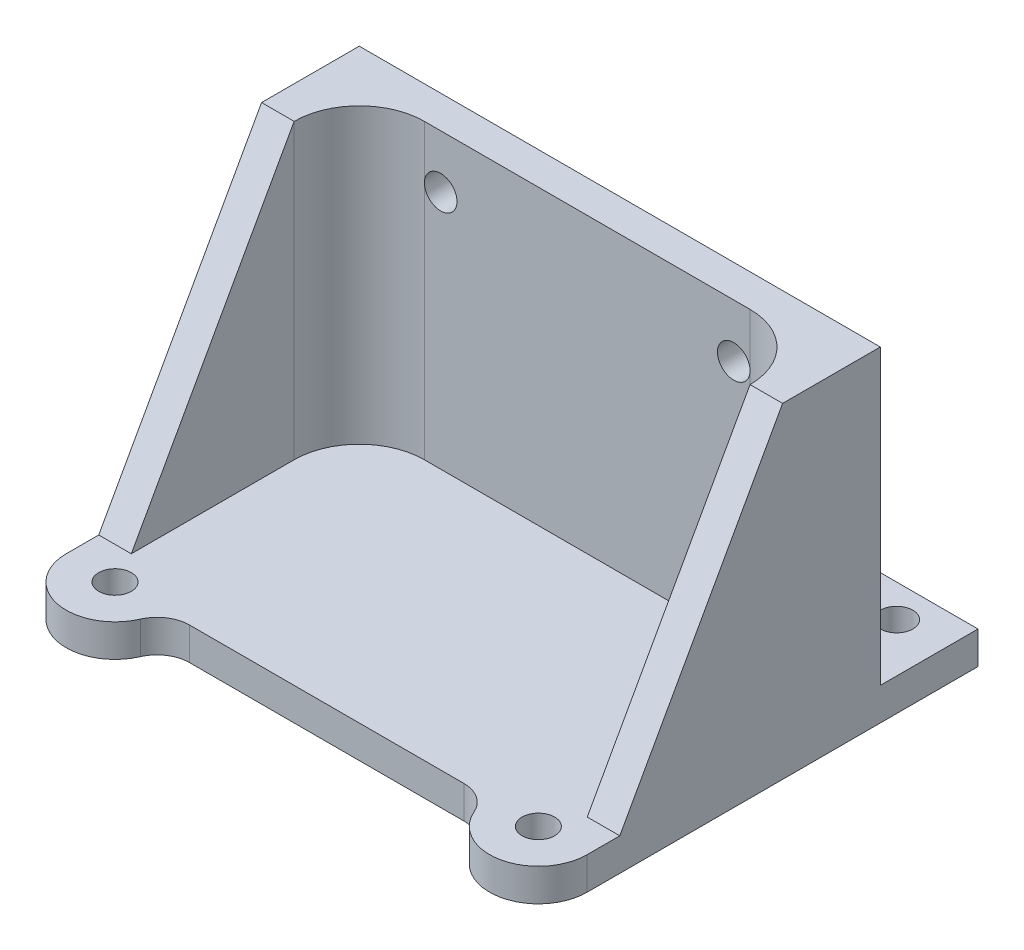
ISO-10303-21;
HEADER;
FILE_DESCRIPTION(('STEP AP214'),'2;1');
FILE_NAME('part.step','',(''),(''),'','','');
FILE_SCHEMA(('AUTOMOTIVE_DESIGN { 1 0 10303 214 1 1 1 1 }'));
ENDSEC;
DATA;
#1=APPLICATION_CONTEXT('core data for automotive mechanical design processes');
#2=APPLICATION_PROTOCOL_DEFINITION('international standard','automotive_design',2000,#1);
#3=PRODUCT_CONTEXT('',#1,'mechanical');
#4=PRODUCT('Part','Part','',(#3));
#5=PRODUCT_RELATED_PRODUCT_CATEGORY('part','',(#4));
#6=PRODUCT_DEFINITION_FORMATION('','',#4);
#7=PRODUCT_DEFINITION_CONTEXT('part definition',#1,'design');
#8=PRODUCT_DEFINITION('design','',#6,#7);
#9=PRODUCT_DEFINITION_SHAPE('','',#8);
#10=(LENGTH_UNIT() NAMED_UNIT(*) SI_UNIT(.MILLI.,.METRE.));
#11=(NAMED_UNIT(*) PLANE_ANGLE_UNIT() SI_UNIT($,.RADIAN.));
#12=(NAMED_UNIT(*) SI_UNIT($,.STERADIAN.) SOLID_ANGLE_UNIT());
#13=UNCERTAINTY_MEASURE_WITH_UNIT(LENGTH_MEASURE(1.E-05),#10,'distance_accuracy_value','');
#14=(GEOMETRIC_REPRESENTATION_CONTEXT(3) GLOBAL_UNCERTAINTY_ASSIGNED_CONTEXT((#13)) GLOBAL_UNIT_ASSIGNED_CONTEXT((#10,
#11,#12)) REPRESENTATION_CONTEXT('',''));
#15=CARTESIAN_POINT('',(0.,0.,0.));
#16=DIRECTION('',(0.,0.,1.));
#17=DIRECTION('',(1.,0.,0.));
#18=AXIS2_PLACEMENT_3D('',#15,#16,#17);
#19=CARTESIAN_POINT('',(0.,5.,30.));
#20=DIRECTION('',(0.,0.,-1.));
#21=DIRECTION('',(-1.,0.,0.));
#22=AXIS2_PLACEMENT_3D('',#19,#20,#21);
#23=PLANE('',#22);
#24=DIRECTION('',(1.,0.,0.));
#25=VECTOR('',#24,1.);
#26=CARTESIAN_POINT('',(0.,0.,30.));
#27=LINE('',#26,#25);
#28=CARTESIAN_POINT('',(-21.0435607626104,0.,30.));
#29=VERTEX_POINT('',#28);
#30=CARTESIAN_POINT('',(21.0435607626104,0.,30.));
#31=VERTEX_POINT('',#30);
#32=EDGE_CURVE('E197',#29,#31,#27,.T.);
#33=ORIENTED_EDGE('',*,*,#32,.T.);
#34=DIRECTION('',(0.,1.,0.));
#35=VECTOR('',#34,1.);
#36=CARTESIAN_POINT('',(21.0435607626104,5.,30.));
#37=LINE('',#36,#35);
#38=CARTESIAN_POINT('',(21.0435607626104,5.,30.));
#39=VERTEX_POINT('',#38);
#40=EDGE_CURVE('E289',#31,#39,#37,.T.);
#41=ORIENTED_EDGE('',*,*,#40,.T.);
#42=DIRECTION('',(1.,0.,0.));
#43=VECTOR('',#42,1.);
#44=CARTESIAN_POINT('',(0.,5.,30.));
#45=LINE('',#44,#43);
#46=CARTESIAN_POINT('',(-21.0435607626104,5.,30.));
#47=VERTEX_POINT('',#46);
#48=EDGE_CURVE('E231',#47,#39,#45,.T.);
#49=ORIENTED_EDGE('',*,*,#48,.F.);
#50=DIRECTION('',(0.,1.,0.));
#51=VECTOR('',#50,1.);
#52=CARTESIAN_POINT('',(-21.0435607626104,0.,30.));
#53=LINE('',#52,#51);
#54=EDGE_CURVE('E286',#47,#29,#53,.F.);
#55=ORIENTED_EDGE('',*,*,#54,.T.);
#56=EDGE_LOOP('',(#33,#41,#49,#55));
#57=FACE_BOUND('',#56,.T.);
#58=ADVANCED_FACE('F35',(#57),#23,.F.);
#59=CARTESIAN_POINT('',(32.5,5.,30.));
#60=DIRECTION('',(0.,-1.,0.));
#61=DIRECTION('',(0.,0.,-1.));
#62=AXIS2_PLACEMENT_3D('',#59,#60,#61);
#63=CYLINDRICAL_SURFACE('',#62,7.5);
#64=CARTESIAN_POINT('',(32.5,5.,30.));
#65=DIRECTION('',(0.,1.,0.));
#66=DIRECTION('',(0.,0.,1.));
#67=AXIS2_PLACEMENT_3D('',#64,#65,#66);
#68=CIRCLE('',#67,7.5);
#69=CARTESIAN_POINT('',(25.6261364575662,5.,33.));
#70=VERTEX_POINT('',#69);
#71=CARTESIAN_POINT('',(40.,5.,30.));
#72=VERTEX_POINT('',#71);
#73=EDGE_CURVE('E234',#70,#72,#68,.T.);
#74=ORIENTED_EDGE('',*,*,#73,.F.);
#75=DIRECTION('',(0.,-1.,0.));
#76=VECTOR('',#75,1.);
#77=CARTESIAN_POINT('',(25.6261364575662,5.,33.));
#78=LINE('',#77,#76);
#79=CARTESIAN_POINT('',(25.6261364575662,0.,33.));
#80=VERTEX_POINT('',#79);
#81=EDGE_CURVE('E283',#70,#80,#78,.T.);
#82=ORIENTED_EDGE('',*,*,#81,.T.);
#83=CARTESIAN_POINT('',(32.5,0.,30.));
#84=DIRECTION('',(0.,1.,0.));
#85=DIRECTION('',(0.,0.,1.));
#86=AXIS2_PLACEMENT_3D('',#83,#84,#85);
#87=CIRCLE('',#86,7.5);
#88=CARTESIAN_POINT('',(40.,0.,30.));
#89=VERTEX_POINT('',#88);
#90=EDGE_CURVE('E200',#80,#89,#87,.T.);
#91=ORIENTED_EDGE('',*,*,#90,.T.);
#92=DIRECTION('',(0.,-1.,0.));
#93=VECTOR('',#92,1.);
#94=CARTESIAN_POINT('',(40.,5.,30.));
#95=LINE('',#94,#93);
#96=EDGE_CURVE('E210',#72,#89,#95,.T.);
#97=ORIENTED_EDGE('',*,*,#96,.F.);
#98=EDGE_LOOP('',(#74,#82,#91,#97));
#99=FACE_BOUND('',#98,.T.);
#100=ADVANCED_FACE('F303',(#99),#63,.T.);
#101=CARTESIAN_POINT('',(40.,5.,0.));
#102=DIRECTION('',(-1.,0.,0.));
#103=DIRECTION('',(0.,0.,1.));
#104=AXIS2_PLACEMENT_3D('',#101,#102,#103);
#105=PLANE('',#104);
#106=DIRECTION('',(0.,0.,-1.));
#107=VECTOR('',#106,1.);
#108=CARTESIAN_POINT('',(40.,50.,0.));
#109=LINE('',#108,#107);
#110=CARTESIAN_POINT('',(40.,50.,0.));
#111=VERTEX_POINT('',#110);
#112=CARTESIAN_POINT('',(40.,50.,-15.));
#113=VERTEX_POINT('',#112);
#114=EDGE_CURVE('E344',#111,#113,#109,.T.);
#115=ORIENTED_EDGE('',*,*,#114,.F.);
#116=DIRECTION('',(0.,0.874157276121538,-0.485642931178632));
#117=VECTOR('',#116,1.);
#118=CARTESIAN_POINT('',(40.,50.,0.));
#119=LINE('',#118,#117);
#120=CARTESIAN_POINT('',(40.,5.,25.));
#121=VERTEX_POINT('',#120);
#122=EDGE_CURVE('E171',#121,#111,#119,.T.);
#123=ORIENTED_EDGE('',*,*,#122,.F.);
#124=DIRECTION('',(0.,0.,-1.));
#125=VECTOR('',#124,1.);
#126=CARTESIAN_POINT('',(40.,5.,0.));
#127=LINE('',#126,#125);
#128=EDGE_CURVE('E236',#72,#121,#127,.T.);
#129=ORIENTED_EDGE('',*,*,#128,.F.);
#130=ORIENTED_EDGE('',*,*,#96,.T.);
#131=DIRECTION('',(0.,0.,-1.));
#132=VECTOR('',#131,1.);
#133=CARTESIAN_POINT('',(40.,0.,0.));
#134=LINE('',#133,#132);
#135=CARTESIAN_POINT('',(40.,0.,-30.));
#136=VERTEX_POINT('',#135);
#137=EDGE_CURVE('E202',#89,#136,#134,.T.);
#138=ORIENTED_EDGE('',*,*,#137,.T.);
#139=DIRECTION('',(0.,-1.,0.));
#140=VECTOR('',#139,1.);
#141=CARTESIAN_POINT('',(40.,5.,-30.));
#142=LINE('',#141,#140);
#143=CARTESIAN_POINT('',(40.,5.,-30.));
#144=VERTEX_POINT('',#143);
#145=EDGE_CURVE('E325',#144,#136,#142,.T.);
#146=ORIENTED_EDGE('',*,*,#145,.F.);
#147=DIRECTION('',(0.,0.,-1.));
#148=VECTOR('',#147,1.);
#149=CARTESIAN_POINT('',(40.,5.,0.));
#150=LINE('',#149,#148);
#151=CARTESIAN_POINT('',(40.,5.,-15.));
#152=VERTEX_POINT('',#151);
#153=EDGE_CURVE('E379',#152,#144,#150,.T.);
#154=ORIENTED_EDGE('',*,*,#153,.F.);
#155=DIRECTION('',(0.,-1.,0.));
#156=VECTOR('',#155,1.);
#157=CARTESIAN_POINT('',(40.,50.,-15.));
#158=LINE('',#157,#156);
#159=EDGE_CURVE('E194',#113,#152,#158,.T.);
#160=ORIENTED_EDGE('',*,*,#159,.F.);
#161=EDGE_LOOP('',(#115,#123,#129,#130,#138,#146,#154,#160));
#162=FACE_BOUND('',#161,.T.);
#163=ADVANCED_FACE('F390',(#162),#105,.F.);
#164=CARTESIAN_POINT('',(-40.,5.,0.));
#165=DIRECTION('',(-1.,0.,0.));
#166=DIRECTION('',(0.,0.,1.));
#167=AXIS2_PLACEMENT_3D('',#164,#165,#166);
#168=PLANE('',#167);
#169=DIRECTION('',(0.,0.874157276121538,-0.485642931178632));
#170=VECTOR('',#169,1.);
#171=CARTESIAN_POINT('',(-40.,50.,0.));
#172=LINE('',#171,#170);
#173=CARTESIAN_POINT('',(-40.,5.,25.));
#174=VERTEX_POINT('',#173);
#175=CARTESIAN_POINT('',(-40.,50.,0.));
#176=VERTEX_POINT('',#175);
#177=EDGE_CURVE('E160',#174,#176,#172,.T.);
#178=ORIENTED_EDGE('',*,*,#177,.T.);
#179=DIRECTION('',(0.,0.,-1.));
#180=VECTOR('',#179,1.);
#181=CARTESIAN_POINT('',(-40.,50.,0.));
#182=LINE('',#181,#180);
#183=CARTESIAN_POINT('',(-40.,50.,-15.));
#184=VERTEX_POINT('',#183);
#185=EDGE_CURVE('E348',#176,#184,#182,.T.);
#186=ORIENTED_EDGE('',*,*,#185,.T.);
#187=DIRECTION('',(0.,-1.,0.));
#188=VECTOR('',#187,1.);
#189=CARTESIAN_POINT('',(-40.,50.,-15.));
#190=LINE('',#189,#188);
#191=CARTESIAN_POINT('',(-40.,5.,-15.));
#192=VERTEX_POINT('',#191);
#193=EDGE_CURVE('E214',#184,#192,#190,.T.);
#194=ORIENTED_EDGE('',*,*,#193,.T.);
#195=DIRECTION('',(0.,0.,-1.));
#196=VECTOR('',#195,1.);
#197=CARTESIAN_POINT('',(-40.,5.,0.));
#198=LINE('',#197,#196);
#199=CARTESIAN_POINT('',(-40.,5.,-30.));
#200=VERTEX_POINT('',#199);
#201=EDGE_CURVE('E321',#192,#200,#198,.T.);
#202=ORIENTED_EDGE('',*,*,#201,.T.);
#203=DIRECTION('',(0.,-1.,0.));
#204=VECTOR('',#203,1.);
#205=CARTESIAN_POINT('',(-40.,5.,-30.));
#206=LINE('',#205,#204);
#207=CARTESIAN_POINT('',(-40.,0.,-30.));
#208=VERTEX_POINT('',#207);
#209=EDGE_CURVE('E318',#200,#208,#206,.T.);
#210=ORIENTED_EDGE('',*,*,#209,.T.);
#211=DIRECTION('',(0.,0.,-1.));
#212=VECTOR('',#211,1.);
#213=CARTESIAN_POINT('',(-40.,0.,0.));
#214=LINE('',#213,#212);
#215=CARTESIAN_POINT('',(-40.,0.,30.));
#216=VERTEX_POINT('',#215);
#217=EDGE_CURVE('E204',#216,#208,#214,.T.);
#218=ORIENTED_EDGE('',*,*,#217,.F.);
#219=DIRECTION('',(0.,-1.,0.));
#220=VECTOR('',#219,1.);
#221=CARTESIAN_POINT('',(-40.,5.,30.));
#222=LINE('',#221,#220);
#223=CARTESIAN_POINT('',(-40.,5.,30.));
#224=VERTEX_POINT('',#223);
#225=EDGE_CURVE('E184',#224,#216,#222,.T.);
#226=ORIENTED_EDGE('',*,*,#225,.F.);
#227=DIRECTION('',(0.,0.,-1.));
#228=VECTOR('',#227,1.);
#229=CARTESIAN_POINT('',(-40.,5.,0.));
#230=LINE('',#229,#228);
#231=EDGE_CURVE('E178',#224,#174,#230,.T.);
#232=ORIENTED_EDGE('',*,*,#231,.T.);
#233=EDGE_LOOP('',(#178,#186,#194,#202,#210,#218,#226,#232));
#234=FACE_BOUND('',#233,.T.);
#235=ADVANCED_FACE('F182',(#234),#168,.T.);
#236=CARTESIAN_POINT('',(32.5,5.,30.));
#237=DIRECTION('',(0.,-1.,0.));
#238=DIRECTION('',(0.,0.,-1.));
#239=AXIS2_PLACEMENT_3D('',#236,#237,#238);
#240=CYLINDRICAL_SURFACE('',#239,2.5);
#241=CARTESIAN_POINT('',(32.5,5.,30.));
#242=DIRECTION('',(0.,1.,0.));
#243=DIRECTION('',(0.,0.,1.));
#244=AXIS2_PLACEMENT_3D('',#241,#242,#243);
#245=CIRCLE('',#244,2.5);
#246=CARTESIAN_POINT('',(32.5,5.,32.5));
#247=VERTEX_POINT('',#246);
#248=EDGE_CURVE('E228',#247,#247,#245,.T.);
#249=ORIENTED_EDGE('',*,*,#248,.T.);
#250=EDGE_LOOP('',(#249));
#251=FACE_BOUND('',#250,.T.);
#252=CARTESIAN_POINT('',(32.5,0.,30.));
#253=DIRECTION('',(0.,1.,0.));
#254=DIRECTION('',(0.,0.,1.));
#255=AXIS2_PLACEMENT_3D('',#252,#253,#254);
#256=CIRCLE('',#255,2.5);
#257=CARTESIAN_POINT('',(32.5,0.,32.5));
#258=VERTEX_POINT('',#257);
#259=EDGE_CURVE('E193',#258,#258,#256,.T.);
#260=ORIENTED_EDGE('',*,*,#259,.F.);
#261=EDGE_LOOP('',(#260));
#262=FACE_BOUND('',#261,.T.);
#263=ADVANCED_FACE('F430',(#251,#262),#240,.F.);
#264=CARTESIAN_POINT('',(-32.5,5.,30.));
#265=DIRECTION('',(0.,-1.,0.));
#266=DIRECTION('',(0.,0.,-1.));
#267=AXIS2_PLACEMENT_3D('',#264,#265,#266);
#268=CYLINDRICAL_SURFACE('',#267,2.5);
#269=CARTESIAN_POINT('',(-32.5,5.,30.));
#270=DIRECTION('',(0.,1.,0.));
#271=DIRECTION('',(0.,0.,1.));
#272=AXIS2_PLACEMENT_3D('',#269,#270,#271);
#273=CIRCLE('',#272,2.5);
#274=CARTESIAN_POINT('',(-32.5,5.,32.5));
#275=VERTEX_POINT('',#274);
#276=EDGE_CURVE('E208',#275,#275,#273,.T.);
#277=ORIENTED_EDGE('',*,*,#276,.T.);
#278=EDGE_LOOP('',(#277));
#279=FACE_BOUND('',#278,.T.);
#280=CARTESIAN_POINT('',(-32.5,0.,30.));
#281=DIRECTION('',(0.,1.,0.));
#282=DIRECTION('',(0.,0.,1.));
#283=AXIS2_PLACEMENT_3D('',#280,#281,#282);
#284=CIRCLE('',#283,2.5);
#285=CARTESIAN_POINT('',(-32.5,0.,32.5));
#286=VERTEX_POINT('',#285);
#287=EDGE_CURVE('E190',#286,#286,#284,.T.);
#288=ORIENTED_EDGE('',*,*,#287,.F.);
#289=EDGE_LOOP('',(#288));
#290=FACE_BOUND('',#289,.T.);
#291=ADVANCED_FACE('F433',(#279,#290),#268,.F.);
#292=CARTESIAN_POINT('',(-32.5,5.,30.));
#293=DIRECTION('',(0.,-1.,0.));
#294=DIRECTION('',(0.,0.,-1.));
#295=AXIS2_PLACEMENT_3D('',#292,#293,#294);
#296=CYLINDRICAL_SURFACE('',#295,7.5);
#297=CARTESIAN_POINT('',(-32.5,0.,30.));
#298=DIRECTION('',(0.,1.,0.));
#299=DIRECTION('',(0.,0.,1.));
#300=AXIS2_PLACEMENT_3D('',#297,#298,#299);
#301=CIRCLE('',#300,7.5);
#302=CARTESIAN_POINT('',(-25.6261364575662,0.,33.));
#303=VERTEX_POINT('',#302);
#304=EDGE_CURVE('E206',#216,#303,#301,.T.);
#305=ORIENTED_EDGE('',*,*,#304,.T.);
#306=DIRECTION('',(0.,-1.,0.));
#307=VECTOR('',#306,1.);
#308=CARTESIAN_POINT('',(-25.6261364575662,5.,33.));
#309=LINE('',#308,#307);
#310=CARTESIAN_POINT('',(-25.6261364575662,5.,33.));
#311=VERTEX_POINT('',#310);
#312=EDGE_CURVE('E50',#303,#311,#309,.F.);
#313=ORIENTED_EDGE('',*,*,#312,.T.);
#314=CARTESIAN_POINT('',(-32.5,5.,30.));
#315=DIRECTION('',(0.,1.,0.));
#316=DIRECTION('',(0.,0.,1.));
#317=AXIS2_PLACEMENT_3D('',#314,#315,#316);
#318=CIRCLE('',#317,7.5);
#319=EDGE_CURVE('E185',#224,#311,#318,.T.);
#320=ORIENTED_EDGE('',*,*,#319,.F.);
#321=ORIENTED_EDGE('',*,*,#225,.T.);
#322=EDGE_LOOP('',(#305,#313,#320,#321));
#323=FACE_BOUND('',#322,.T.);
#324=ADVANCED_FACE('F314',(#323),#296,.T.);
#325=CARTESIAN_POINT('',(0.,5.,0.));
#326=DIRECTION('',(0.,1.,0.));
#327=DIRECTION('',(0.,0.,1.));
#328=AXIS2_PLACEMENT_3D('',#325,#326,#327);
#329=PLANE('',#328);
#330=DIRECTION('',(-1.,0.,0.));
#331=VECTOR('',#330,1.);
#332=CARTESIAN_POINT('',(0.,5.,-10.));
#333=LINE('',#332,#331);
#334=CARTESIAN_POINT('',(25.,5.,-10.));
#335=VERTEX_POINT('',#334);
#336=CARTESIAN_POINT('',(-25.,5.,-10.));
#337=VERTEX_POINT('',#336);
#338=EDGE_CURVE('E245',#335,#337,#333,.T.);
#339=ORIENTED_EDGE('',*,*,#338,.T.);
#340=CARTESIAN_POINT('',(-25.,5.,0.));
#341=DIRECTION('',(0.,1.,0.));
#342=DIRECTION('',(0.,0.,1.));
#343=AXIS2_PLACEMENT_3D('',#340,#341,#342);
#344=CIRCLE('',#343,10.);
#345=CARTESIAN_POINT('',(-35.,5.,0.));
#346=VERTEX_POINT('',#345);
#347=EDGE_CURVE('E248',#337,#346,#344,.T.);
#348=ORIENTED_EDGE('',*,*,#347,.T.);
#349=DIRECTION('',(0.,0.,1.));
#350=VECTOR('',#349,1.);
#351=CARTESIAN_POINT('',(-35.,5.,0.));
#352=LINE('',#351,#350);
#353=CARTESIAN_POINT('',(-35.,5.,25.));
#354=VERTEX_POINT('',#353);
#355=EDGE_CURVE('E180',#346,#354,#352,.T.);
#356=ORIENTED_EDGE('',*,*,#355,.T.);
#357=DIRECTION('',(-1.,0.,0.));
#358=VECTOR('',#357,1.);
#359=CARTESIAN_POINT('',(0.,5.,25.));
#360=LINE('',#359,#358);
#361=EDGE_CURVE('E164',#354,#174,#360,.T.);
#362=ORIENTED_EDGE('',*,*,#361,.T.);
#363=ORIENTED_EDGE('',*,*,#231,.F.);
#364=ORIENTED_EDGE('',*,*,#319,.T.);
#365=CARTESIAN_POINT('',(-21.0435607626104,5.,35.));
#366=DIRECTION('',(0.,1.,0.));
#367=DIRECTION('',(0.,0.,1.));
#368=AXIS2_PLACEMENT_3D('',#365,#366,#367);
#369=CIRCLE('',#368,5.);
#370=EDGE_CURVE('E11',#311,#47,#369,.F.);
#371=ORIENTED_EDGE('',*,*,#370,.T.);
#372=ORIENTED_EDGE('',*,*,#48,.T.);
#373=CARTESIAN_POINT('',(21.0435607626104,5.,35.));
#374=DIRECTION('',(0.,1.,0.));
#375=DIRECTION('',(0.,0.,1.));
#376=AXIS2_PLACEMENT_3D('',#373,#374,#375);
#377=CIRCLE('',#376,5.);
#378=EDGE_CURVE('E294',#39,#70,#377,.F.);
#379=ORIENTED_EDGE('',*,*,#378,.T.);
#380=ORIENTED_EDGE('',*,*,#73,.T.);
#381=ORIENTED_EDGE('',*,*,#128,.T.);
#382=DIRECTION('',(-1.,0.,0.));
#383=VECTOR('',#382,1.);
#384=CARTESIAN_POINT('',(0.,5.,25.));
#385=LINE('',#384,#383);
#386=CARTESIAN_POINT('',(35.,5.,25.));
#387=VERTEX_POINT('',#386);
#388=EDGE_CURVE('E239',#121,#387,#385,.T.);
#389=ORIENTED_EDGE('',*,*,#388,.T.);
#390=DIRECTION('',(0.,0.,-1.));
#391=VECTOR('',#390,1.);
#392=CARTESIAN_POINT('',(35.,5.,0.));
#393=LINE('',#392,#391);
#394=CARTESIAN_POINT('',(35.,5.,0.));
#395=VERTEX_POINT('',#394);
#396=EDGE_CURVE('E242',#387,#395,#393,.T.);
#397=ORIENTED_EDGE('',*,*,#396,.T.);
#398=CARTESIAN_POINT('',(25.,5.,0.));
#399=DIRECTION('',(0.,1.,0.));
#400=DIRECTION('',(0.,0.,1.));
#401=AXIS2_PLACEMENT_3D('',#398,#399,#400);
#402=CIRCLE('',#401,10.);
#403=EDGE_CURVE('E249',#395,#335,#402,.T.);
#404=ORIENTED_EDGE('',*,*,#403,.T.);
#405=EDGE_LOOP('',(#339,#348,#356,#362,#363,#364,#371,#372,#379,#380,#381,#389,#397,#404));
#406=FACE_BOUND('',#405,.T.);
#407=ORIENTED_EDGE('',*,*,#248,.F.);
#408=EDGE_LOOP('',(#407));
#409=FACE_BOUND('',#408,.T.);
#410=ORIENTED_EDGE('',*,*,#276,.F.);
#411=EDGE_LOOP('',(#410));
#412=FACE_BOUND('',#411,.T.);
#413=ADVANCED_FACE('F176',(#406,#409,#412),#329,.T.);
#414=CARTESIAN_POINT('',(0.,0.,0.));
#415=DIRECTION('',(0.,1.,0.));
#416=DIRECTION('',(0.,0.,1.));
#417=AXIS2_PLACEMENT_3D('',#414,#415,#416);
#418=PLANE('',#417);
#419=ORIENTED_EDGE('',*,*,#217,.T.);
#420=DIRECTION('',(1.,0.,0.));
#421=VECTOR('',#420,1.);
#422=CARTESIAN_POINT('',(0.,0.,-30.));
#423=LINE('',#422,#421);
#424=EDGE_CURVE('E329',#208,#136,#423,.T.);
#425=ORIENTED_EDGE('',*,*,#424,.T.);
#426=ORIENTED_EDGE('',*,*,#137,.F.);
#427=ORIENTED_EDGE('',*,*,#90,.F.);
#428=CARTESIAN_POINT('',(21.0435607626104,0.,35.));
#429=DIRECTION('',(0.,1.,0.));
#430=DIRECTION('',(0.,0.,1.));
#431=AXIS2_PLACEMENT_3D('',#428,#429,#430);
#432=CIRCLE('',#431,5.);
#433=EDGE_CURVE('E292',#80,#31,#432,.T.);
#434=ORIENTED_EDGE('',*,*,#433,.T.);
#435=ORIENTED_EDGE('',*,*,#32,.F.);
#436=CARTESIAN_POINT('',(-21.0435607626104,0.,35.));
#437=DIRECTION('',(0.,1.,0.));
#438=DIRECTION('',(0.,0.,1.));
#439=AXIS2_PLACEMENT_3D('',#436,#437,#438);
#440=CIRCLE('',#439,5.);
#441=EDGE_CURVE('E43',#29,#303,#440,.T.);
#442=ORIENTED_EDGE('',*,*,#441,.T.);
#443=ORIENTED_EDGE('',*,*,#304,.F.);
#444=EDGE_LOOP('',(#419,#425,#426,#427,#434,#435,#442,#443));
#445=FACE_BOUND('',#444,.T.);
#446=ORIENTED_EDGE('',*,*,#287,.T.);
#447=EDGE_LOOP('',(#446));
#448=FACE_BOUND('',#447,.T.);
#449=ORIENTED_EDGE('',*,*,#259,.T.);
#450=EDGE_LOOP('',(#449));
#451=FACE_BOUND('',#450,.T.);
#452=CARTESIAN_POINT('',(32.5,0.,-25.));
#453=DIRECTION('',(0.,1.,0.));
#454=DIRECTION('',(0.,0.,1.));
#455=AXIS2_PLACEMENT_3D('',#452,#453,#454);
#456=CIRCLE('',#455,2.5);
#457=CARTESIAN_POINT('',(32.5,0.,-22.5));
#458=VERTEX_POINT('',#457);
#459=EDGE_CURVE('E339',#458,#458,#456,.T.);
#460=ORIENTED_EDGE('',*,*,#459,.T.);
#461=EDGE_LOOP('',(#460));
#462=FACE_BOUND('',#461,.T.);
#463=CARTESIAN_POINT('',(-32.5,0.,-25.));
#464=DIRECTION('',(0.,1.,0.));
#465=DIRECTION('',(0.,0.,1.));
#466=AXIS2_PLACEMENT_3D('',#463,#464,#465);
#467=CIRCLE('',#466,2.5);
#468=CARTESIAN_POINT('',(-32.5,0.,-22.5));
#469=VERTEX_POINT('',#468);
#470=EDGE_CURVE('E333',#469,#469,#467,.T.);
#471=ORIENTED_EDGE('',*,*,#470,.T.);
#472=EDGE_LOOP('',(#471));
#473=FACE_BOUND('',#472,.T.);
#474=ADVANCED_FACE('F307',(#445,#448,#451,#462,#473),#418,.F.);
#475=CARTESIAN_POINT('',(35.,50.,0.));
#476=DIRECTION('',(-1.,0.,0.));
#477=DIRECTION('',(0.,0.,1.));
#478=AXIS2_PLACEMENT_3D('',#475,#476,#477);
#479=PLANE('',#478);
#480=DIRECTION('',(0.,-0.874157276121538,0.485642931178632));
#481=VECTOR('',#480,1.);
#482=CARTESIAN_POINT('',(35.,50.,0.));
#483=LINE('',#482,#481);
#484=CARTESIAN_POINT('',(35.,50.,0.));
#485=VERTEX_POINT('',#484);
#486=EDGE_CURVE('E361',#485,#387,#483,.T.);
#487=ORIENTED_EDGE('',*,*,#486,.F.);
#488=DIRECTION('',(0.,-1.,0.));
#489=VECTOR('',#488,1.);
#490=CARTESIAN_POINT('',(35.,5.,0.));
#491=LINE('',#490,#489);
#492=EDGE_CURVE('E277',#485,#395,#491,.T.);
#493=ORIENTED_EDGE('',*,*,#492,.T.);
#494=ORIENTED_EDGE('',*,*,#396,.F.);
#495=EDGE_LOOP('',(#487,#493,#494));
#496=FACE_BOUND('',#495,.T.);
#497=ADVANCED_FACE('F396',(#496),#479,.T.);
#498=CARTESIAN_POINT('',(0.,50.,-15.));
#499=DIRECTION('',(0.,0.,-1.));
#500=DIRECTION('',(-1.,0.,0.));
#501=AXIS2_PLACEMENT_3D('',#498,#499,#500);
#502=PLANE('',#501);
#503=CARTESIAN_POINT('',(22.5,41.8337610291763,-15.));
#504=DIRECTION('',(0.,0.,-1.));
#505=DIRECTION('',(-1.,0.,0.));
#506=AXIS2_PLACEMENT_3D('',#503,#504,#505);
#507=CIRCLE('',#506,2.5);
#508=CARTESIAN_POINT('',(20.,41.8337610291763,-15.));
#509=VERTEX_POINT('',#508);
#510=EDGE_CURVE('E405',#509,#509,#507,.T.);
#511=ORIENTED_EDGE('',*,*,#510,.F.);
#512=EDGE_LOOP('',(#511));
#513=FACE_BOUND('',#512,.T.);
#514=CARTESIAN_POINT('',(-22.5,41.8337610291763,-15.));
#515=DIRECTION('',(0.,0.,-1.));
#516=DIRECTION('',(-1.,0.,0.));
#517=AXIS2_PLACEMENT_3D('',#514,#515,#516);
#518=CIRCLE('',#517,2.5);
#519=CARTESIAN_POINT('',(-25.,41.8337610291763,-15.));
#520=VERTEX_POINT('',#519);
#521=EDGE_CURVE('E399',#520,#520,#518,.T.);
#522=ORIENTED_EDGE('',*,*,#521,.F.);
#523=EDGE_LOOP('',(#522));
#524=FACE_BOUND('',#523,.T.);
#525=DIRECTION('',(1.,0.,0.));
#526=VECTOR('',#525,1.);
#527=CARTESIAN_POINT('',(0.,5.,-15.));
#528=LINE('',#527,#526);
#529=EDGE_CURVE('E375',#192,#152,#528,.T.);
#530=ORIENTED_EDGE('',*,*,#529,.F.);
#531=ORIENTED_EDGE('',*,*,#193,.F.);
#532=DIRECTION('',(1.,0.,0.));
#533=VECTOR('',#532,1.);
#534=CARTESIAN_POINT('',(0.,50.,-15.));
#535=LINE('',#534,#533);
#536=EDGE_CURVE('E346',#184,#113,#535,.T.);
#537=ORIENTED_EDGE('',*,*,#536,.T.);
#538=ORIENTED_EDGE('',*,*,#159,.T.);
#539=EDGE_LOOP('',(#530,#531,#537,#538));
#540=FACE_BOUND('',#539,.T.);
#541=ADVANCED_FACE('F386',(#513,#524,#540),#502,.T.);
#542=CARTESIAN_POINT('',(-35.,50.,0.));
#543=DIRECTION('',(1.,0.,0.));
#544=DIRECTION('',(0.,0.,-1.));
#545=AXIS2_PLACEMENT_3D('',#542,#543,#544);
#546=PLANE('',#545);
#547=ORIENTED_EDGE('',*,*,#355,.F.);
#548=DIRECTION('',(0.,-1.,0.));
#549=VECTOR('',#548,1.);
#550=CARTESIAN_POINT('',(-35.,50.,0.));
#551=LINE('',#550,#549);
#552=CARTESIAN_POINT('',(-35.,50.,0.));
#553=VERTEX_POINT('',#552);
#554=EDGE_CURVE('E275',#346,#553,#551,.F.);
#555=ORIENTED_EDGE('',*,*,#554,.T.);
#556=DIRECTION('',(0.,0.874157276121538,-0.485642931178632));
#557=VECTOR('',#556,1.);
#558=CARTESIAN_POINT('',(-35.,50.,0.));
#559=LINE('',#558,#557);
#560=EDGE_CURVE('E360',#354,#553,#559,.T.);
#561=ORIENTED_EDGE('',*,*,#560,.F.);
#562=EDGE_LOOP('',(#547,#555,#561));
#563=FACE_BOUND('',#562,.T.);
#564=ADVANCED_FACE('F359',(#563),#546,.T.);
#565=CARTESIAN_POINT('',(0.,50.,-10.));
#566=DIRECTION('',(0.,0.,1.));
#567=DIRECTION('',(1.,0.,0.));
#568=AXIS2_PLACEMENT_3D('',#565,#566,#567);
#569=PLANE('',#568);
#570=DIRECTION('',(0.,-1.,0.));
#571=VECTOR('',#570,1.);
#572=CARTESIAN_POINT('',(25.,50.,-10.));
#573=LINE('',#572,#571);
#574=CARTESIAN_POINT('',(25.,41.8337610291763,-10.));
#575=VERTEX_POINT('',#574);
#576=EDGE_CURVE('E255',#335,#575,#573,.F.);
#577=ORIENTED_EDGE('',*,*,#576,.T.);
#578=CARTESIAN_POINT('',(22.5,41.8337610291763,-10.));
#579=DIRECTION('',(0.,0.,1.));
#580=DIRECTION('',(1.,0.,0.));
#581=AXIS2_PLACEMENT_3D('',#578,#579,#580);
#582=CIRCLE('',#581,2.5);
#583=EDGE_CURVE('E410',#575,#575,#582,.T.);
#584=ORIENTED_EDGE('',*,*,#583,.F.);
#585=CARTESIAN_POINT('',(25.,50.,-10.));
#586=VERTEX_POINT('',#585);
#587=EDGE_CURVE('E265',#575,#586,#573,.F.);
#588=ORIENTED_EDGE('',*,*,#587,.T.);
#589=DIRECTION('',(-1.,0.,0.));
#590=VECTOR('',#589,1.);
#591=CARTESIAN_POINT('',(0.,50.,-10.));
#592=LINE('',#591,#590);
#593=CARTESIAN_POINT('',(-25.,50.,-10.));
#594=VERTEX_POINT('',#593);
#595=EDGE_CURVE('E218',#586,#594,#592,.T.);
#596=ORIENTED_EDGE('',*,*,#595,.T.);
#597=DIRECTION('',(0.,-1.,0.));
#598=VECTOR('',#597,1.);
#599=CARTESIAN_POINT('',(-25.,5.,-10.));
#600=LINE('',#599,#598);
#601=CARTESIAN_POINT('',(-25.,41.8337610291763,-10.));
#602=VERTEX_POINT('',#601);
#603=EDGE_CURVE('E267',#594,#602,#600,.T.);
#604=ORIENTED_EDGE('',*,*,#603,.T.);
#605=CARTESIAN_POINT('',(-22.5,41.8337610291763,-10.));
#606=DIRECTION('',(0.,0.,1.));
#607=DIRECTION('',(1.,0.,0.));
#608=AXIS2_PLACEMENT_3D('',#605,#606,#607);
#609=CIRCLE('',#608,2.5);
#610=EDGE_CURVE('E401',#602,#602,#609,.T.);
#611=ORIENTED_EDGE('',*,*,#610,.F.);
#612=EDGE_CURVE('E258',#602,#337,#600,.T.);
#613=ORIENTED_EDGE('',*,*,#612,.T.);
#614=ORIENTED_EDGE('',*,*,#338,.F.);
#615=EDGE_LOOP('',(#577,#584,#588,#596,#604,#611,#613,#614));
#616=FACE_BOUND('',#615,.T.);
#617=ADVANCED_FACE('F253',(#616),#569,.T.);
#618=CARTESIAN_POINT('',(0.,50.,0.));
#619=DIRECTION('',(0.,1.,0.));
#620=DIRECTION('',(0.,0.,1.));
#621=AXIS2_PLACEMENT_3D('',#618,#619,#620);
#622=PLANE('',#621);
#623=DIRECTION('',(-1.,0.,0.));
#624=VECTOR('',#623,1.);
#625=CARTESIAN_POINT('',(0.,50.,0.));
#626=LINE('',#625,#624);
#627=EDGE_CURVE('E213',#111,#485,#626,.T.);
#628=ORIENTED_EDGE('',*,*,#627,.F.);
#629=ORIENTED_EDGE('',*,*,#114,.T.);
#630=ORIENTED_EDGE('',*,*,#536,.F.);
#631=ORIENTED_EDGE('',*,*,#185,.F.);
#632=DIRECTION('',(1.,0.,0.));
#633=VECTOR('',#632,1.);
#634=CARTESIAN_POINT('',(-40.,50.,0.));
#635=LINE('',#634,#633);
#636=EDGE_CURVE('E167',#176,#553,#635,.T.);
#637=ORIENTED_EDGE('',*,*,#636,.T.);
#638=CARTESIAN_POINT('',(-25.,50.,0.));
#639=DIRECTION('',(0.,1.,0.));
#640=DIRECTION('',(0.,0.,1.));
#641=AXIS2_PLACEMENT_3D('',#638,#639,#640);
#642=CIRCLE('',#641,10.);
#643=EDGE_CURVE('E279',#553,#594,#642,.F.);
#644=ORIENTED_EDGE('',*,*,#643,.T.);
#645=ORIENTED_EDGE('',*,*,#595,.F.);
#646=CARTESIAN_POINT('',(25.,50.,0.));
#647=DIRECTION('',(0.,1.,0.));
#648=DIRECTION('',(0.,0.,1.));
#649=AXIS2_PLACEMENT_3D('',#646,#647,#648);
#650=CIRCLE('',#649,10.);
#651=EDGE_CURVE('E281',#586,#485,#650,.F.);
#652=ORIENTED_EDGE('',*,*,#651,.T.);
#653=EDGE_LOOP('',(#628,#629,#630,#631,#637,#644,#645,#652));
#654=FACE_BOUND('',#653,.T.);
#655=ADVANCED_FACE('F364',(#654),#622,.T.);
#656=CARTESIAN_POINT('',(-32.5,5.,-25.));
#657=DIRECTION('',(0.,-1.,0.));
#658=DIRECTION('',(0.,0.,-1.));
#659=AXIS2_PLACEMENT_3D('',#656,#657,#658);
#660=CYLINDRICAL_SURFACE('',#659,2.5);
#661=CARTESIAN_POINT('',(-32.5,5.,-25.));
#662=DIRECTION('',(0.,1.,0.));
#663=DIRECTION('',(0.,0.,1.));
#664=AXIS2_PLACEMENT_3D('',#661,#662,#663);
#665=CIRCLE('',#664,2.5);
#666=CARTESIAN_POINT('',(-32.5,5.,-22.5));
#667=VERTEX_POINT('',#666);
#668=EDGE_CURVE('E336',#667,#667,#665,.T.);
#669=ORIENTED_EDGE('',*,*,#668,.T.);
#670=EDGE_LOOP('',(#669));
#671=FACE_BOUND('',#670,.T.);
#672=ORIENTED_EDGE('',*,*,#470,.F.);
#673=EDGE_LOOP('',(#672));
#674=FACE_BOUND('',#673,.T.);
#675=ADVANCED_FACE('F523',(#671,#674),#660,.F.);
#676=CARTESIAN_POINT('',(32.5,5.,-25.));
#677=DIRECTION('',(0.,-1.,0.));
#678=DIRECTION('',(0.,0.,-1.));
#679=AXIS2_PLACEMENT_3D('',#676,#677,#678);
#680=CYLINDRICAL_SURFACE('',#679,2.5);
#681=CARTESIAN_POINT('',(32.5,5.,-25.));
#682=DIRECTION('',(0.,1.,0.));
#683=DIRECTION('',(0.,0.,1.));
#684=AXIS2_PLACEMENT_3D('',#681,#682,#683);
#685=CIRCLE('',#684,2.5);
#686=CARTESIAN_POINT('',(32.5,5.,-22.5));
#687=VERTEX_POINT('',#686);
#688=EDGE_CURVE('E332',#687,#687,#685,.T.);
#689=ORIENTED_EDGE('',*,*,#688,.T.);
#690=EDGE_LOOP('',(#689));
#691=FACE_BOUND('',#690,.T.);
#692=ORIENTED_EDGE('',*,*,#459,.F.);
#693=EDGE_LOOP('',(#692));
#694=FACE_BOUND('',#693,.T.);
#695=ADVANCED_FACE('F528',(#691,#694),#680,.F.);
#696=CARTESIAN_POINT('',(0.,5.,-30.));
#697=DIRECTION('',(0.,0.,-1.));
#698=DIRECTION('',(-1.,0.,0.));
#699=AXIS2_PLACEMENT_3D('',#696,#697,#698);
#700=PLANE('',#699);
#701=ORIENTED_EDGE('',*,*,#424,.F.);
#702=ORIENTED_EDGE('',*,*,#209,.F.);
#703=DIRECTION('',(1.,0.,0.));
#704=VECTOR('',#703,1.);
#705=CARTESIAN_POINT('',(0.,5.,-30.));
#706=LINE('',#705,#704);
#707=EDGE_CURVE('E326',#200,#144,#706,.T.);
#708=ORIENTED_EDGE('',*,*,#707,.T.);
#709=ORIENTED_EDGE('',*,*,#145,.T.);
#710=EDGE_LOOP('',(#701,#702,#708,#709));
#711=FACE_BOUND('',#710,.T.);
#712=ADVANCED_FACE('F330',(#711),#700,.T.);
#713=CARTESIAN_POINT('',(0.,5.,0.));
#714=DIRECTION('',(0.,1.,0.));
#715=DIRECTION('',(0.,0.,1.));
#716=AXIS2_PLACEMENT_3D('',#713,#714,#715);
#717=PLANE('',#716);
#718=ORIENTED_EDGE('',*,*,#688,.F.);
#719=EDGE_LOOP('',(#718));
#720=FACE_BOUND('',#719,.T.);
#721=ORIENTED_EDGE('',*,*,#668,.F.);
#722=EDGE_LOOP('',(#721));
#723=FACE_BOUND('',#722,.T.);
#724=ORIENTED_EDGE('',*,*,#201,.F.);
#725=ORIENTED_EDGE('',*,*,#529,.T.);
#726=ORIENTED_EDGE('',*,*,#153,.T.);
#727=ORIENTED_EDGE('',*,*,#707,.F.);
#728=EDGE_LOOP('',(#724,#725,#726,#727));
#729=FACE_BOUND('',#728,.T.);
#730=ADVANCED_FACE('F384',(#720,#723,#729),#717,.T.);
#731=CARTESIAN_POINT('',(-40.,50.,0.));
#732=DIRECTION('',(0.,-0.485642931178632,-0.874157276121538));
#733=DIRECTION('',(0.,0.874157276121538,-0.485642931178632));
#734=AXIS2_PLACEMENT_3D('',#731,#732,#733);
#735=PLANE('',#734);
#736=ORIENTED_EDGE('',*,*,#560,.T.);
#737=ORIENTED_EDGE('',*,*,#636,.F.);
#738=ORIENTED_EDGE('',*,*,#177,.F.);
#739=ORIENTED_EDGE('',*,*,#361,.F.);
#740=EDGE_LOOP('',(#736,#737,#738,#739));
#741=FACE_BOUND('',#740,.T.);
#742=ADVANCED_FACE('F163',(#741),#735,.F.);
#743=ORIENTED_EDGE('',*,*,#486,.T.);
#744=ORIENTED_EDGE('',*,*,#388,.F.);
#745=ORIENTED_EDGE('',*,*,#122,.T.);
#746=ORIENTED_EDGE('',*,*,#627,.T.);
#747=EDGE_LOOP('',(#743,#744,#745,#746));
#748=FACE_BOUND('',#747,.T.);
#749=ADVANCED_FACE('F398',(#748),#735,.F.);
#750=CARTESIAN_POINT('',(-25.,50.,0.));
#751=DIRECTION('',(0.,1.,0.));
#752=DIRECTION('',(0.,0.,1.));
#753=AXIS2_PLACEMENT_3D('',#750,#751,#752);
#754=CYLINDRICAL_SURFACE('',#753,10.);
#755=ORIENTED_EDGE('',*,*,#643,.F.);
#756=ORIENTED_EDGE('',*,*,#554,.F.);
#757=ORIENTED_EDGE('',*,*,#347,.F.);
#758=ORIENTED_EDGE('',*,*,#612,.F.);
#759=ORIENTED_EDGE('',*,*,#603,.F.);
#760=EDGE_LOOP('',(#755,#756,#757,#758,#759));
#761=FACE_BOUND('',#760,.T.);
#762=ADVANCED_FACE('F356',(#761),#754,.F.);
#763=CARTESIAN_POINT('',(25.,50.,0.));
#764=DIRECTION('',(0.,1.,0.));
#765=DIRECTION('',(0.,0.,1.));
#766=AXIS2_PLACEMENT_3D('',#763,#764,#765);
#767=CYLINDRICAL_SURFACE('',#766,10.);
#768=ORIENTED_EDGE('',*,*,#651,.F.);
#769=ORIENTED_EDGE('',*,*,#587,.F.);
#770=ORIENTED_EDGE('',*,*,#576,.F.);
#771=ORIENTED_EDGE('',*,*,#403,.F.);
#772=ORIENTED_EDGE('',*,*,#492,.F.);
#773=EDGE_LOOP('',(#768,#769,#770,#771,#772));
#774=FACE_BOUND('',#773,.T.);
#775=ADVANCED_FACE('F262',(#774),#767,.F.);
#776=CARTESIAN_POINT('',(-22.5,41.8337610291763,-20.));
#777=DIRECTION('',(0.,0.,1.));
#778=DIRECTION('',(1.,0.,0.));
#779=AXIS2_PLACEMENT_3D('',#776,#777,#778);
#780=CYLINDRICAL_SURFACE('',#779,2.5);
#781=ORIENTED_EDGE('',*,*,#521,.T.);
#782=EDGE_LOOP('',(#781));
#783=FACE_BOUND('',#782,.T.);
#784=ORIENTED_EDGE('',*,*,#610,.T.);
#785=EDGE_LOOP('',(#784));
#786=FACE_BOUND('',#785,.T.);
#787=ADVANCED_FACE('F414',(#783,#786),#780,.F.);
#788=CARTESIAN_POINT('',(22.5,41.8337610291763,-20.));
#789=DIRECTION('',(0.,0.,1.));
#790=DIRECTION('',(1.,0.,0.));
#791=AXIS2_PLACEMENT_3D('',#788,#789,#790);
#792=CYLINDRICAL_SURFACE('',#791,2.5);
#793=ORIENTED_EDGE('',*,*,#510,.T.);
#794=EDGE_LOOP('',(#793));
#795=FACE_BOUND('',#794,.T.);
#796=ORIENTED_EDGE('',*,*,#583,.T.);
#797=EDGE_LOOP('',(#796));
#798=FACE_BOUND('',#797,.T.);
#799=ADVANCED_FACE('F412',(#795,#798),#792,.F.);
#800=CARTESIAN_POINT('',(21.0435607626104,5.,35.));
#801=DIRECTION('',(0.,-1.,0.));
#802=DIRECTION('',(0.,0.,-1.));
#803=AXIS2_PLACEMENT_3D('',#800,#801,#802);
#804=CYLINDRICAL_SURFACE('',#803,5.);
#805=ORIENTED_EDGE('',*,*,#378,.F.);
#806=ORIENTED_EDGE('',*,*,#40,.F.);
#807=ORIENTED_EDGE('',*,*,#433,.F.);
#808=ORIENTED_EDGE('',*,*,#81,.F.);
#809=EDGE_LOOP('',(#805,#806,#807,#808));
#810=FACE_BOUND('',#809,.T.);
#811=ADVANCED_FACE('F306',(#810),#804,.F.);
#812=CARTESIAN_POINT('',(-21.0435607626104,5.,35.));
#813=DIRECTION('',(0.,-1.,0.));
#814=DIRECTION('',(0.,0.,-1.));
#815=AXIS2_PLACEMENT_3D('',#812,#813,#814);
#816=CYLINDRICAL_SURFACE('',#815,5.);
#817=ORIENTED_EDGE('',*,*,#370,.F.);
#818=ORIENTED_EDGE('',*,*,#312,.F.);
#819=ORIENTED_EDGE('',*,*,#441,.F.);
#820=ORIENTED_EDGE('',*,*,#54,.F.);
#821=EDGE_LOOP('',(#817,#818,#819,#820));
#822=FACE_BOUND('',#821,.T.);
#823=ADVANCED_FACE('F37',(#822),#816,.F.);
#824=CLOSED_SHELL('',(#58,#100,#163,#235,#263,#291,#324,#413,#474,#497,#541,#564,#617,#655,#675,
#695,#712,#730,#742,#749,#762,#775,#787,#799,#811,#823));
#825=MANIFOLD_SOLID_BREP('B2',#824);
#826=ADVANCED_BREP_SHAPE_REPRESENTATION('',(#18,#825),#14);
#827=SHAPE_DEFINITION_REPRESENTATION(#9,#826);
ENDSEC;
END-ISO-10303-21;
